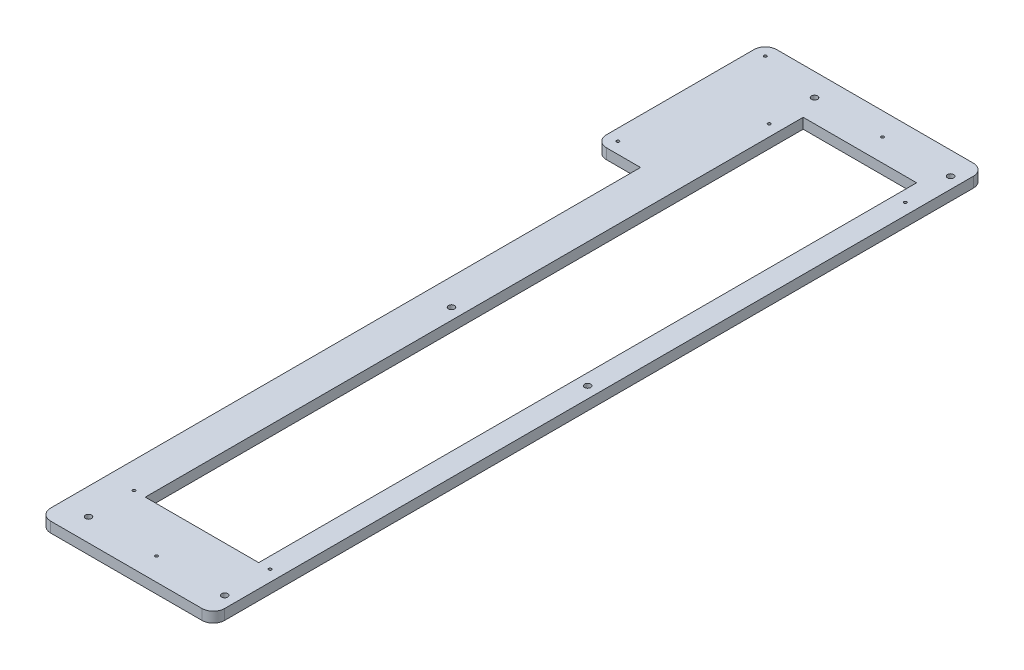
ISO-10303-21;
HEADER;
FILE_DESCRIPTION(('STEP AP214'),'2;1');
FILE_NAME('part.step','',(''),(''),'','','');
FILE_SCHEMA(('AUTOMOTIVE_DESIGN { 1 0 10303 214 1 1 1 1 }'));
ENDSEC;
DATA;
#1=APPLICATION_CONTEXT('core data for automotive mechanical design processes');
#2=APPLICATION_PROTOCOL_DEFINITION('international standard','automotive_design',2000,#1);
#3=PRODUCT_CONTEXT('',#1,'mechanical');
#4=PRODUCT('Part','Part','',(#3));
#5=PRODUCT_RELATED_PRODUCT_CATEGORY('part','',(#4));
#6=PRODUCT_DEFINITION_FORMATION('','',#4);
#7=PRODUCT_DEFINITION_CONTEXT('part definition',#1,'design');
#8=PRODUCT_DEFINITION('design','',#6,#7);
#9=PRODUCT_DEFINITION_SHAPE('','',#8);
#10=(LENGTH_UNIT() NAMED_UNIT(*) SI_UNIT(.MILLI.,.METRE.));
#11=(NAMED_UNIT(*) PLANE_ANGLE_UNIT() SI_UNIT($,.RADIAN.));
#12=(NAMED_UNIT(*) SI_UNIT($,.STERADIAN.) SOLID_ANGLE_UNIT());
#13=UNCERTAINTY_MEASURE_WITH_UNIT(LENGTH_MEASURE(1.E-05),#10,'distance_accuracy_value','');
#14=(GEOMETRIC_REPRESENTATION_CONTEXT(3) GLOBAL_UNCERTAINTY_ASSIGNED_CONTEXT((#13)) GLOBAL_UNIT_ASSIGNED_CONTEXT((#10,
#11,#12)) REPRESENTATION_CONTEXT('',''));
#15=CARTESIAN_POINT('',(0.,0.,0.));
#16=DIRECTION('',(0.,0.,1.));
#17=DIRECTION('',(1.,0.,0.));
#18=AXIS2_PLACEMENT_3D('',#15,#16,#17);
#19=CARTESIAN_POINT('',(0.,5.8,0.));
#20=DIRECTION('',(-1.,0.,0.));
#21=DIRECTION('',(0.,0.,1.));
#22=AXIS2_PLACEMENT_3D('',#19,#20,#21);
#23=PLANE('',#22);
#24=DIRECTION('',(0.,0.,-1.));
#25=VECTOR('',#24,1.);
#26=CARTESIAN_POINT('',(0.,5.8,0.));
#27=LINE('',#26,#25);
#28=CARTESIAN_POINT('',(0.,5.8,425.45));
#29=VERTEX_POINT('',#28);
#30=CARTESIAN_POINT('',(0.,5.8,6.35));
#31=VERTEX_POINT('',#30);
#32=EDGE_CURVE('E220',#29,#31,#27,.T.);
#33=ORIENTED_EDGE('',*,*,#32,.F.);
#34=DIRECTION('',(0.,-1.,0.));
#35=VECTOR('',#34,1.);
#36=CARTESIAN_POINT('',(0.,5.8,425.45));
#37=LINE('',#36,#35);
#38=CARTESIAN_POINT('',(0.,0.,425.45));
#39=VERTEX_POINT('',#38);
#40=EDGE_CURVE('E417',#29,#39,#37,.T.);
#41=ORIENTED_EDGE('',*,*,#40,.T.);
#42=DIRECTION('',(0.,0.,-1.));
#43=VECTOR('',#42,1.);
#44=CARTESIAN_POINT('',(0.,0.,0.));
#45=LINE('',#44,#43);
#46=CARTESIAN_POINT('',(0.,0.,6.35));
#47=VERTEX_POINT('',#46);
#48=EDGE_CURVE('E224',#39,#47,#45,.T.);
#49=ORIENTED_EDGE('',*,*,#48,.T.);
#50=DIRECTION('',(0.,-1.,0.));
#51=VECTOR('',#50,1.);
#52=CARTESIAN_POINT('',(0.,5.8,6.35));
#53=LINE('',#52,#51);
#54=EDGE_CURVE('E230',#47,#31,#53,.F.);
#55=ORIENTED_EDGE('',*,*,#54,.T.);
#56=EDGE_LOOP('',(#33,#41,#49,#55));
#57=FACE_BOUND('',#56,.T.);
#58=ADVANCED_FACE('F34',(#57),#23,.F.);
#59=CARTESIAN_POINT('',(0.,5.8,0.));
#60=DIRECTION('',(0.,0.,1.));
#61=DIRECTION('',(1.,0.,0.));
#62=AXIS2_PLACEMENT_3D('',#59,#60,#61);
#63=PLANE('',#62);
#64=DIRECTION('',(-1.,0.,0.));
#65=VECTOR('',#64,1.);
#66=CARTESIAN_POINT('',(0.,5.8,0.));
#67=LINE('',#66,#65);
#68=CARTESIAN_POINT('',(-6.35,5.8,0.));
#69=VERTEX_POINT('',#68);
#70=CARTESIAN_POINT('',(-116.45,5.8,0.));
#71=VERTEX_POINT('',#70);
#72=EDGE_CURVE('E231',#69,#71,#67,.T.);
#73=ORIENTED_EDGE('',*,*,#72,.F.);
#74=DIRECTION('',(0.,-1.,0.));
#75=VECTOR('',#74,1.);
#76=CARTESIAN_POINT('',(-6.35,5.8,0.));
#77=LINE('',#76,#75);
#78=CARTESIAN_POINT('',(-6.35,0.,0.));
#79=VERTEX_POINT('',#78);
#80=EDGE_CURVE('E11',#69,#79,#77,.T.);
#81=ORIENTED_EDGE('',*,*,#80,.T.);
#82=DIRECTION('',(-1.,0.,0.));
#83=VECTOR('',#82,1.);
#84=CARTESIAN_POINT('',(0.,0.,0.));
#85=LINE('',#84,#83);
#86=CARTESIAN_POINT('',(-116.45,0.,0.));
#87=VERTEX_POINT('',#86);
#88=EDGE_CURVE('E221',#79,#87,#85,.T.);
#89=ORIENTED_EDGE('',*,*,#88,.T.);
#90=DIRECTION('',(0.,1.,0.));
#91=VECTOR('',#90,1.);
#92=CARTESIAN_POINT('',(-116.45,5.8,0.));
#93=LINE('',#92,#91);
#94=EDGE_CURVE('E42',#87,#71,#93,.T.);
#95=ORIENTED_EDGE('',*,*,#94,.T.);
#96=EDGE_LOOP('',(#73,#81,#89,#95));
#97=FACE_BOUND('',#96,.T.);
#98=ADVANCED_FACE('F352',(#97),#63,.F.);
#99=CARTESIAN_POINT('',(0.,5.8,431.8));
#100=DIRECTION('',(0.,0.,-1.));
#101=DIRECTION('',(-1.,0.,0.));
#102=AXIS2_PLACEMENT_3D('',#99,#100,#101);
#103=PLANE('',#102);
#104=DIRECTION('',(1.,0.,0.));
#105=VECTOR('',#104,1.);
#106=CARTESIAN_POINT('',(0.,0.,431.8));
#107=LINE('',#106,#105);
#108=CARTESIAN_POINT('',(-91.05,0.,431.8));
#109=VERTEX_POINT('',#108);
#110=CARTESIAN_POINT('',(-6.34999999999995,0.,431.8));
#111=VERTEX_POINT('',#110);
#112=EDGE_CURVE('E217',#109,#111,#107,.T.);
#113=ORIENTED_EDGE('',*,*,#112,.T.);
#114=DIRECTION('',(0.,-1.,0.));
#115=VECTOR('',#114,1.);
#116=CARTESIAN_POINT('',(-6.34999999999995,5.8,431.8));
#117=LINE('',#116,#115);
#118=CARTESIAN_POINT('',(-6.34999999999995,5.8,431.8));
#119=VERTEX_POINT('',#118);
#120=EDGE_CURVE('E389',#111,#119,#117,.F.);
#121=ORIENTED_EDGE('',*,*,#120,.T.);
#122=DIRECTION('',(1.,0.,0.));
#123=VECTOR('',#122,1.);
#124=CARTESIAN_POINT('',(0.,5.8,431.8));
#125=LINE('',#124,#123);
#126=CARTESIAN_POINT('',(-91.05,5.8,431.8));
#127=VERTEX_POINT('',#126);
#128=EDGE_CURVE('E228',#127,#119,#125,.T.);
#129=ORIENTED_EDGE('',*,*,#128,.F.);
#130=DIRECTION('',(0.,1.,0.));
#131=VECTOR('',#130,1.);
#132=CARTESIAN_POINT('',(-91.05,0.,431.8));
#133=LINE('',#132,#131);
#134=EDGE_CURVE('E429',#127,#109,#133,.F.);
#135=ORIENTED_EDGE('',*,*,#134,.T.);
#136=EDGE_LOOP('',(#113,#121,#129,#135));
#137=FACE_BOUND('',#136,.T.);
#138=ADVANCED_FACE('F321',(#137),#103,.F.);
#139=CARTESIAN_POINT('',(0.,5.8,431.8));
#140=DIRECTION('',(0.,-1.,0.));
#141=DIRECTION('',(0.,0.,-1.));
#142=AXIS2_PLACEMENT_3D('',#139,#140,#141);
#143=PLANE('',#142);
#144=CARTESIAN_POINT('',(-116.45,5.8,6.35));
#145=DIRECTION('',(0.,1.,0.));
#146=DIRECTION('',(0.,0.,1.));
#147=AXIS2_PLACEMENT_3D('',#144,#145,#146);
#148=CIRCLE('',#147,0.793749999999993);
#149=CARTESIAN_POINT('',(-116.45,5.8,7.14374999999999));
#150=VERTEX_POINT('',#149);
#151=EDGE_CURVE('E445',#150,#150,#148,.T.);
#152=ORIENTED_EDGE('',*,*,#151,.F.);
#153=EDGE_LOOP('',(#152));
#154=FACE_BOUND('',#153,.T.);
#155=CARTESIAN_POINT('',(-116.45,5.8,88.9));
#156=DIRECTION('',(0.,1.,0.));
#157=DIRECTION('',(0.,0.,1.));
#158=AXIS2_PLACEMENT_3D('',#155,#156,#157);
#159=CIRCLE('',#158,0.793749999999993);
#160=CARTESIAN_POINT('',(-116.45,5.8,89.69375));
#161=VERTEX_POINT('',#160);
#162=EDGE_CURVE('E441',#161,#161,#159,.T.);
#163=ORIENTED_EDGE('',*,*,#162,.F.);
#164=EDGE_LOOP('',(#163));
#165=FACE_BOUND('',#164,.T.);
#166=CARTESIAN_POINT('',(-44.4499999999999,5.8,419.1));
#167=DIRECTION('',(0.,1.,0.));
#168=DIRECTION('',(0.,0.,-1.));
#169=AXIS2_PLACEMENT_3D('',#166,#167,#168);
#170=CIRCLE('',#169,0.793750000000007);
#171=CARTESIAN_POINT('',(-44.4499999999999,5.8,418.30625));
#172=VERTEX_POINT('',#171);
#173=EDGE_CURVE('E164',#172,#172,#170,.T.);
#174=ORIENTED_EDGE('',*,*,#173,.F.);
#175=EDGE_LOOP('',(#174));
#176=FACE_BOUND('',#175,.T.);
#177=CARTESIAN_POINT('',(-82.5499999999999,5.8,393.7));
#178=DIRECTION('',(0.,1.,0.));
#179=DIRECTION('',(0.,0.,-1.));
#180=AXIS2_PLACEMENT_3D('',#177,#178,#179);
#181=CIRCLE('',#180,0.793749999999984);
#182=CARTESIAN_POINT('',(-82.5499999999999,5.8,392.90625));
#183=VERTEX_POINT('',#182);
#184=EDGE_CURVE('E181',#183,#183,#181,.T.);
#185=ORIENTED_EDGE('',*,*,#184,.F.);
#186=EDGE_LOOP('',(#185));
#187=FACE_BOUND('',#186,.T.);
#188=CARTESIAN_POINT('',(-6.34999999999995,5.8,393.7));
#189=DIRECTION('',(0.,1.,0.));
#190=DIRECTION('',(0.,0.,-1.));
#191=AXIS2_PLACEMENT_3D('',#188,#189,#190);
#192=CIRCLE('',#191,0.793750000000008);
#193=CARTESIAN_POINT('',(-6.34999999999995,5.8,392.90625));
#194=VERTEX_POINT('',#193);
#195=EDGE_CURVE('E186',#194,#194,#192,.T.);
#196=ORIENTED_EDGE('',*,*,#195,.F.);
#197=EDGE_LOOP('',(#196));
#198=FACE_BOUND('',#197,.T.);
#199=CARTESIAN_POINT('',(-6.34999999999999,5.8,38.1));
#200=DIRECTION('',(0.,1.,0.));
#201=DIRECTION('',(0.,0.,1.));
#202=AXIS2_PLACEMENT_3D('',#199,#200,#201);
#203=CIRCLE('',#202,0.79375);
#204=CARTESIAN_POINT('',(-6.34999999999999,5.8,38.89375));
#205=VERTEX_POINT('',#204);
#206=EDGE_CURVE('E192',#205,#205,#203,.T.);
#207=ORIENTED_EDGE('',*,*,#206,.F.);
#208=EDGE_LOOP('',(#207));
#209=FACE_BOUND('',#208,.T.);
#210=CARTESIAN_POINT('',(-82.55,5.8,38.1));
#211=DIRECTION('',(0.,1.,0.));
#212=DIRECTION('',(0.,0.,1.));
#213=AXIS2_PLACEMENT_3D('',#210,#211,#212);
#214=CIRCLE('',#213,0.793749999999993);
#215=CARTESIAN_POINT('',(-82.55,5.8,38.89375));
#216=VERTEX_POINT('',#215);
#217=EDGE_CURVE('E198',#216,#216,#214,.T.);
#218=ORIENTED_EDGE('',*,*,#217,.F.);
#219=EDGE_LOOP('',(#218));
#220=FACE_BOUND('',#219,.T.);
#221=CARTESIAN_POINT('',(-44.45,5.8,12.7));
#222=DIRECTION('',(0.,1.,0.));
#223=DIRECTION('',(0.,0.,1.));
#224=AXIS2_PLACEMENT_3D('',#221,#222,#223);
#225=CIRCLE('',#224,0.79375);
#226=CARTESIAN_POINT('',(-44.45,5.8,13.49375));
#227=VERTEX_POINT('',#226);
#228=EDGE_CURVE('E204',#227,#227,#225,.T.);
#229=ORIENTED_EDGE('',*,*,#228,.F.);
#230=EDGE_LOOP('',(#229));
#231=FACE_BOUND('',#230,.T.);
#232=DIRECTION('',(1.,0.,0.));
#233=VECTOR('',#232,1.);
#234=CARTESIAN_POINT('',(-76.2,5.8,393.7));
#235=LINE('',#234,#233);
#236=CARTESIAN_POINT('',(-76.2,5.8,393.7));
#237=VERTEX_POINT('',#236);
#238=CARTESIAN_POINT('',(-12.7,5.8,393.7));
#239=VERTEX_POINT('',#238);
#240=EDGE_CURVE('E287',#237,#239,#235,.T.);
#241=ORIENTED_EDGE('',*,*,#240,.F.);
#242=DIRECTION('',(0.,0.,1.));
#243=VECTOR('',#242,1.);
#244=CARTESIAN_POINT('',(-76.2,5.8,25.4));
#245=LINE('',#244,#243);
#246=CARTESIAN_POINT('',(-76.2,5.8,25.4));
#247=VERTEX_POINT('',#246);
#248=EDGE_CURVE('E290',#247,#237,#245,.T.);
#249=ORIENTED_EDGE('',*,*,#248,.F.);
#250=DIRECTION('',(-1.,0.,0.));
#251=VECTOR('',#250,1.);
#252=CARTESIAN_POINT('',(-76.2,5.8,25.4));
#253=LINE('',#252,#251);
#254=CARTESIAN_POINT('',(-12.7,5.8,25.4));
#255=VERTEX_POINT('',#254);
#256=EDGE_CURVE('E281',#255,#247,#253,.T.);
#257=ORIENTED_EDGE('',*,*,#256,.F.);
#258=DIRECTION('',(0.,0.,-1.));
#259=VECTOR('',#258,1.);
#260=CARTESIAN_POINT('',(-12.7,5.8,25.4));
#261=LINE('',#260,#259);
#262=EDGE_CURVE('E284',#239,#255,#261,.T.);
#263=ORIENTED_EDGE('',*,*,#262,.F.);
#264=EDGE_LOOP('',(#241,#249,#257,#263));
#265=FACE_BOUND('',#264,.T.);
#266=CARTESIAN_POINT('',(-82.55,5.8,12.7));
#267=DIRECTION('',(0.,1.,0.));
#268=DIRECTION('',(0.,0.,1.));
#269=AXIS2_PLACEMENT_3D('',#266,#267,#268);
#270=CIRCLE('',#269,1.69999999999999);
#271=CARTESIAN_POINT('',(-82.55,5.8,14.4));
#272=VERTEX_POINT('',#271);
#273=EDGE_CURVE('E268',#272,#272,#270,.T.);
#274=ORIENTED_EDGE('',*,*,#273,.F.);
#275=EDGE_LOOP('',(#274));
#276=FACE_BOUND('',#275,.T.);
#277=CARTESIAN_POINT('',(-6.34999999999999,5.8,12.7));
#278=DIRECTION('',(0.,1.,0.));
#279=DIRECTION('',(0.,0.,1.));
#280=AXIS2_PLACEMENT_3D('',#277,#278,#279);
#281=CIRCLE('',#280,1.7);
#282=CARTESIAN_POINT('',(-6.34999999999999,5.8,14.4));
#283=VERTEX_POINT('',#282);
#284=EDGE_CURVE('E262',#283,#283,#281,.T.);
#285=ORIENTED_EDGE('',*,*,#284,.F.);
#286=EDGE_LOOP('',(#285));
#287=FACE_BOUND('',#286,.T.);
#288=CARTESIAN_POINT('',(-6.34999999999999,5.8,419.1));
#289=DIRECTION('',(0.,1.,0.));
#290=DIRECTION('',(0.,0.,1.));
#291=AXIS2_PLACEMENT_3D('',#288,#289,#290);
#292=CIRCLE('',#291,1.7);
#293=CARTESIAN_POINT('',(-6.34999999999999,5.8,420.8));
#294=VERTEX_POINT('',#293);
#295=EDGE_CURVE('E256',#294,#294,#292,.T.);
#296=ORIENTED_EDGE('',*,*,#295,.F.);
#297=EDGE_LOOP('',(#296));
#298=FACE_BOUND('',#297,.T.);
#299=CARTESIAN_POINT('',(-82.55,5.8,419.1));
#300=DIRECTION('',(0.,1.,0.));
#301=DIRECTION('',(0.,0.,1.));
#302=AXIS2_PLACEMENT_3D('',#299,#300,#301);
#303=CIRCLE('',#302,1.69999999999999);
#304=CARTESIAN_POINT('',(-82.55,5.8,420.8));
#305=VERTEX_POINT('',#304);
#306=EDGE_CURVE('E250',#305,#305,#303,.T.);
#307=ORIENTED_EDGE('',*,*,#306,.F.);
#308=EDGE_LOOP('',(#307));
#309=FACE_BOUND('',#308,.T.);
#310=CARTESIAN_POINT('',(-82.55,5.8,215.9));
#311=DIRECTION('',(0.,1.,0.));
#312=DIRECTION('',(0.,0.,1.));
#313=AXIS2_PLACEMENT_3D('',#310,#311,#312);
#314=CIRCLE('',#313,1.69999999999999);
#315=CARTESIAN_POINT('',(-82.55,5.8,217.6));
#316=VERTEX_POINT('',#315);
#317=EDGE_CURVE('E244',#316,#316,#314,.T.);
#318=ORIENTED_EDGE('',*,*,#317,.F.);
#319=EDGE_LOOP('',(#318));
#320=FACE_BOUND('',#319,.T.);
#321=CARTESIAN_POINT('',(-6.34999999999994,5.8,215.9));
#322=DIRECTION('',(0.,1.,0.));
#323=DIRECTION('',(0.,0.,1.));
#324=AXIS2_PLACEMENT_3D('',#321,#322,#323);
#325=CIRCLE('',#324,1.7);
#326=CARTESIAN_POINT('',(-6.34999999999994,5.8,217.6));
#327=VERTEX_POINT('',#326);
#328=EDGE_CURVE('E238',#327,#327,#325,.T.);
#329=ORIENTED_EDGE('',*,*,#328,.F.);
#330=EDGE_LOOP('',(#329));
#331=FACE_BOUND('',#330,.T.);
#332=ORIENTED_EDGE('',*,*,#128,.T.);
#333=CARTESIAN_POINT('',(-6.34999999999995,5.8,425.45));
#334=DIRECTION('',(0.,-1.,0.));
#335=DIRECTION('',(0.,0.,-1.));
#336=AXIS2_PLACEMENT_3D('',#333,#334,#335);
#337=CIRCLE('',#336,6.35);
#338=EDGE_CURVE('E393',#119,#29,#337,.F.);
#339=ORIENTED_EDGE('',*,*,#338,.T.);
#340=ORIENTED_EDGE('',*,*,#32,.T.);
#341=CARTESIAN_POINT('',(-6.35,5.8,6.35));
#342=DIRECTION('',(0.,-1.,0.));
#343=DIRECTION('',(0.,0.,-1.));
#344=AXIS2_PLACEMENT_3D('',#341,#342,#343);
#345=CIRCLE('',#344,6.35);
#346=EDGE_CURVE('E384',#31,#69,#345,.F.);
#347=ORIENTED_EDGE('',*,*,#346,.T.);
#348=ORIENTED_EDGE('',*,*,#72,.T.);
#349=CARTESIAN_POINT('',(-116.45,5.8,6.35000000000001));
#350=DIRECTION('',(0.,-1.,0.));
#351=DIRECTION('',(0.,0.,-1.));
#352=AXIS2_PLACEMENT_3D('',#349,#350,#351);
#353=CIRCLE('',#352,6.35);
#354=CARTESIAN_POINT('',(-122.8,5.8,6.35000000000001));
#355=VERTEX_POINT('',#354);
#356=EDGE_CURVE('E386',#71,#355,#353,.F.);
#357=ORIENTED_EDGE('',*,*,#356,.T.);
#358=DIRECTION('',(0.,0.,1.));
#359=VECTOR('',#358,1.);
#360=CARTESIAN_POINT('',(-122.8,5.8,0.));
#361=LINE('',#360,#359);
#362=CARTESIAN_POINT('',(-122.8,5.8,88.9));
#363=VERTEX_POINT('',#362);
#364=EDGE_CURVE('E149',#355,#363,#361,.T.);
#365=ORIENTED_EDGE('',*,*,#364,.T.);
#366=CARTESIAN_POINT('',(-116.45,5.8,88.9));
#367=DIRECTION('',(0.,-1.,0.));
#368=DIRECTION('',(0.,0.,-1.));
#369=AXIS2_PLACEMENT_3D('',#366,#367,#368);
#370=CIRCLE('',#369,6.35);
#371=CARTESIAN_POINT('',(-116.45,5.8,95.25));
#372=VERTEX_POINT('',#371);
#373=EDGE_CURVE('E57',#363,#372,#370,.F.);
#374=ORIENTED_EDGE('',*,*,#373,.T.);
#375=DIRECTION('',(1.,0.,0.));
#376=VECTOR('',#375,1.);
#377=CARTESIAN_POINT('',(-97.4,5.8,95.25));
#378=LINE('',#377,#376);
#379=CARTESIAN_POINT('',(-97.4,5.8,95.25));
#380=VERTEX_POINT('',#379);
#381=EDGE_CURVE('E140',#372,#380,#378,.T.);
#382=ORIENTED_EDGE('',*,*,#381,.T.);
#383=DIRECTION('',(0.,0.,1.));
#384=VECTOR('',#383,1.);
#385=CARTESIAN_POINT('',(-97.4,5.8,0.));
#386=LINE('',#385,#384);
#387=CARTESIAN_POINT('',(-97.4,5.8,425.45));
#388=VERTEX_POINT('',#387);
#389=EDGE_CURVE('E144',#380,#388,#386,.T.);
#390=ORIENTED_EDGE('',*,*,#389,.T.);
#391=CARTESIAN_POINT('',(-91.05,5.8,425.45));
#392=DIRECTION('',(0.,-1.,0.));
#393=DIRECTION('',(0.,0.,-1.));
#394=AXIS2_PLACEMENT_3D('',#391,#392,#393);
#395=CIRCLE('',#394,6.35);
#396=EDGE_CURVE('E49',#388,#127,#395,.F.);
#397=ORIENTED_EDGE('',*,*,#396,.T.);
#398=EDGE_LOOP('',(#332,#339,#340,#347,#348,#357,#365,#374,#382,#390,#397));
#399=FACE_BOUND('',#398,.T.);
#400=ADVANCED_FACE('F143',(#154,#165,#176,#187,#198,#209,#220,#231,#265,#276,#287,#298,#309,
#320,#331,#399),#143,.F.);
#401=CARTESIAN_POINT('',(0.,0.,431.8));
#402=DIRECTION('',(0.,-1.,0.));
#403=DIRECTION('',(0.,0.,-1.));
#404=AXIS2_PLACEMENT_3D('',#401,#402,#403);
#405=PLANE('',#404);
#406=CARTESIAN_POINT('',(-116.45,0.,6.35));
#407=DIRECTION('',(0.,-1.,0.));
#408=DIRECTION('',(0.,0.,-1.));
#409=AXIS2_PLACEMENT_3D('',#406,#407,#408);
#410=CIRCLE('',#409,0.793749999999993);
#411=CARTESIAN_POINT('',(-116.45,0.,5.55625000000001));
#412=VERTEX_POINT('',#411);
#413=EDGE_CURVE('E444',#412,#412,#410,.T.);
#414=ORIENTED_EDGE('',*,*,#413,.F.);
#415=EDGE_LOOP('',(#414));
#416=FACE_BOUND('',#415,.T.);
#417=CARTESIAN_POINT('',(-116.45,0.,88.9));
#418=DIRECTION('',(0.,-1.,0.));
#419=DIRECTION('',(0.,0.,-1.));
#420=AXIS2_PLACEMENT_3D('',#417,#418,#419);
#421=CIRCLE('',#420,0.793749999999993);
#422=CARTESIAN_POINT('',(-116.45,0.,88.10625));
#423=VERTEX_POINT('',#422);
#424=EDGE_CURVE('E413',#423,#423,#421,.T.);
#425=ORIENTED_EDGE('',*,*,#424,.F.);
#426=EDGE_LOOP('',(#425));
#427=FACE_BOUND('',#426,.T.);
#428=CARTESIAN_POINT('',(-44.4499999999999,0.,419.1));
#429=DIRECTION('',(0.,1.,0.));
#430=DIRECTION('',(0.,0.,-1.));
#431=AXIS2_PLACEMENT_3D('',#428,#429,#430);
#432=CIRCLE('',#431,0.793750000000007);
#433=CARTESIAN_POINT('',(-44.4499999999999,0.,418.30625));
#434=VERTEX_POINT('',#433);
#435=EDGE_CURVE('E167',#434,#434,#432,.T.);
#436=ORIENTED_EDGE('',*,*,#435,.T.);
#437=EDGE_LOOP('',(#436));
#438=FACE_BOUND('',#437,.T.);
#439=CARTESIAN_POINT('',(-82.5499999999999,0.,393.7));
#440=DIRECTION('',(0.,1.,0.));
#441=DIRECTION('',(0.,0.,-1.));
#442=AXIS2_PLACEMENT_3D('',#439,#440,#441);
#443=CIRCLE('',#442,0.793749999999984);
#444=CARTESIAN_POINT('',(-82.5499999999999,0.,392.90625));
#445=VERTEX_POINT('',#444);
#446=EDGE_CURVE('E183',#445,#445,#443,.T.);
#447=ORIENTED_EDGE('',*,*,#446,.T.);
#448=EDGE_LOOP('',(#447));
#449=FACE_BOUND('',#448,.T.);
#450=CARTESIAN_POINT('',(-6.34999999999995,0.,393.7));
#451=DIRECTION('',(0.,1.,0.));
#452=DIRECTION('',(0.,0.,-1.));
#453=AXIS2_PLACEMENT_3D('',#450,#451,#452);
#454=CIRCLE('',#453,0.793750000000008);
#455=CARTESIAN_POINT('',(-6.34999999999995,0.,392.90625));
#456=VERTEX_POINT('',#455);
#457=EDGE_CURVE('E189',#456,#456,#454,.T.);
#458=ORIENTED_EDGE('',*,*,#457,.T.);
#459=EDGE_LOOP('',(#458));
#460=FACE_BOUND('',#459,.T.);
#461=CARTESIAN_POINT('',(-6.34999999999999,0.,38.1));
#462=DIRECTION('',(0.,1.,0.));
#463=DIRECTION('',(0.,0.,1.));
#464=AXIS2_PLACEMENT_3D('',#461,#462,#463);
#465=CIRCLE('',#464,0.79375);
#466=CARTESIAN_POINT('',(-6.34999999999999,0.,38.89375));
#467=VERTEX_POINT('',#466);
#468=EDGE_CURVE('E195',#467,#467,#465,.T.);
#469=ORIENTED_EDGE('',*,*,#468,.T.);
#470=EDGE_LOOP('',(#469));
#471=FACE_BOUND('',#470,.T.);
#472=CARTESIAN_POINT('',(-82.55,0.,38.1));
#473=DIRECTION('',(0.,1.,0.));
#474=DIRECTION('',(0.,0.,1.));
#475=AXIS2_PLACEMENT_3D('',#472,#473,#474);
#476=CIRCLE('',#475,0.793749999999993);
#477=CARTESIAN_POINT('',(-82.55,0.,38.89375));
#478=VERTEX_POINT('',#477);
#479=EDGE_CURVE('E201',#478,#478,#476,.T.);
#480=ORIENTED_EDGE('',*,*,#479,.T.);
#481=EDGE_LOOP('',(#480));
#482=FACE_BOUND('',#481,.T.);
#483=CARTESIAN_POINT('',(-44.45,0.,12.7));
#484=DIRECTION('',(0.,1.,0.));
#485=DIRECTION('',(0.,0.,1.));
#486=AXIS2_PLACEMENT_3D('',#483,#484,#485);
#487=CIRCLE('',#486,0.79375);
#488=CARTESIAN_POINT('',(-44.45,0.,13.49375));
#489=VERTEX_POINT('',#488);
#490=EDGE_CURVE('E159',#489,#489,#487,.T.);
#491=ORIENTED_EDGE('',*,*,#490,.T.);
#492=EDGE_LOOP('',(#491));
#493=FACE_BOUND('',#492,.T.);
#494=DIRECTION('',(0.,0.,1.));
#495=VECTOR('',#494,1.);
#496=CARTESIAN_POINT('',(-76.2,0.,25.4));
#497=LINE('',#496,#495);
#498=CARTESIAN_POINT('',(-76.2,0.,25.4));
#499=VERTEX_POINT('',#498);
#500=CARTESIAN_POINT('',(-76.2,0.,393.7));
#501=VERTEX_POINT('',#500);
#502=EDGE_CURVE('E214',#499,#501,#497,.T.);
#503=ORIENTED_EDGE('',*,*,#502,.T.);
#504=DIRECTION('',(1.,0.,0.));
#505=VECTOR('',#504,1.);
#506=CARTESIAN_POINT('',(-76.2,0.,393.7));
#507=LINE('',#506,#505);
#508=CARTESIAN_POINT('',(-12.7,0.,393.7));
#509=VERTEX_POINT('',#508);
#510=EDGE_CURVE('E296',#501,#509,#507,.T.);
#511=ORIENTED_EDGE('',*,*,#510,.T.);
#512=DIRECTION('',(0.,0.,-1.));
#513=VECTOR('',#512,1.);
#514=CARTESIAN_POINT('',(-12.7,0.,25.4));
#515=LINE('',#514,#513);
#516=CARTESIAN_POINT('',(-12.7,0.,25.4));
#517=VERTEX_POINT('',#516);
#518=EDGE_CURVE('E294',#509,#517,#515,.T.);
#519=ORIENTED_EDGE('',*,*,#518,.T.);
#520=DIRECTION('',(-1.,0.,0.));
#521=VECTOR('',#520,1.);
#522=CARTESIAN_POINT('',(-76.2,0.,25.4));
#523=LINE('',#522,#521);
#524=EDGE_CURVE('E276',#517,#499,#523,.T.);
#525=ORIENTED_EDGE('',*,*,#524,.T.);
#526=EDGE_LOOP('',(#503,#511,#519,#525));
#527=FACE_BOUND('',#526,.T.);
#528=CARTESIAN_POINT('',(-82.55,0.,12.7));
#529=DIRECTION('',(0.,1.,0.));
#530=DIRECTION('',(0.,0.,1.));
#531=AXIS2_PLACEMENT_3D('',#528,#529,#530);
#532=CIRCLE('',#531,1.69999999999999);
#533=CARTESIAN_POINT('',(-82.55,0.,14.4));
#534=VERTEX_POINT('',#533);
#535=EDGE_CURVE('E265',#534,#534,#532,.T.);
#536=ORIENTED_EDGE('',*,*,#535,.T.);
#537=EDGE_LOOP('',(#536));
#538=FACE_BOUND('',#537,.T.);
#539=CARTESIAN_POINT('',(-6.34999999999999,0.,12.7));
#540=DIRECTION('',(0.,1.,0.));
#541=DIRECTION('',(0.,0.,1.));
#542=AXIS2_PLACEMENT_3D('',#539,#540,#541);
#543=CIRCLE('',#542,1.7);
#544=CARTESIAN_POINT('',(-6.34999999999999,0.,14.4));
#545=VERTEX_POINT('',#544);
#546=EDGE_CURVE('E259',#545,#545,#543,.T.);
#547=ORIENTED_EDGE('',*,*,#546,.T.);
#548=EDGE_LOOP('',(#547));
#549=FACE_BOUND('',#548,.T.);
#550=CARTESIAN_POINT('',(-6.34999999999999,0.,419.1));
#551=DIRECTION('',(0.,1.,0.));
#552=DIRECTION('',(0.,0.,1.));
#553=AXIS2_PLACEMENT_3D('',#550,#551,#552);
#554=CIRCLE('',#553,1.7);
#555=CARTESIAN_POINT('',(-6.34999999999999,0.,420.8));
#556=VERTEX_POINT('',#555);
#557=EDGE_CURVE('E253',#556,#556,#554,.T.);
#558=ORIENTED_EDGE('',*,*,#557,.T.);
#559=EDGE_LOOP('',(#558));
#560=FACE_BOUND('',#559,.T.);
#561=CARTESIAN_POINT('',(-82.55,0.,419.1));
#562=DIRECTION('',(0.,1.,0.));
#563=DIRECTION('',(0.,0.,1.));
#564=AXIS2_PLACEMENT_3D('',#561,#562,#563);
#565=CIRCLE('',#564,1.69999999999999);
#566=CARTESIAN_POINT('',(-82.55,0.,420.8));
#567=VERTEX_POINT('',#566);
#568=EDGE_CURVE('E247',#567,#567,#565,.T.);
#569=ORIENTED_EDGE('',*,*,#568,.T.);
#570=EDGE_LOOP('',(#569));
#571=FACE_BOUND('',#570,.T.);
#572=CARTESIAN_POINT('',(-82.55,0.,215.9));
#573=DIRECTION('',(0.,1.,0.));
#574=DIRECTION('',(0.,0.,1.));
#575=AXIS2_PLACEMENT_3D('',#572,#573,#574);
#576=CIRCLE('',#575,1.69999999999999);
#577=CARTESIAN_POINT('',(-82.55,0.,217.6));
#578=VERTEX_POINT('',#577);
#579=EDGE_CURVE('E241',#578,#578,#576,.T.);
#580=ORIENTED_EDGE('',*,*,#579,.T.);
#581=EDGE_LOOP('',(#580));
#582=FACE_BOUND('',#581,.T.);
#583=CARTESIAN_POINT('',(-6.34999999999994,0.,215.9));
#584=DIRECTION('',(0.,1.,0.));
#585=DIRECTION('',(0.,0.,1.));
#586=AXIS2_PLACEMENT_3D('',#583,#584,#585);
#587=CIRCLE('',#586,1.7);
#588=CARTESIAN_POINT('',(-6.34999999999994,0.,217.6));
#589=VERTEX_POINT('',#588);
#590=EDGE_CURVE('E227',#589,#589,#587,.T.);
#591=ORIENTED_EDGE('',*,*,#590,.T.);
#592=EDGE_LOOP('',(#591));
#593=FACE_BOUND('',#592,.T.);
#594=ORIENTED_EDGE('',*,*,#48,.F.);
#595=CARTESIAN_POINT('',(-6.34999999999995,0.,425.45));
#596=DIRECTION('',(0.,-1.,0.));
#597=DIRECTION('',(0.,0.,-1.));
#598=AXIS2_PLACEMENT_3D('',#595,#596,#597);
#599=CIRCLE('',#598,6.35);
#600=EDGE_CURVE('E427',#39,#111,#599,.T.);
#601=ORIENTED_EDGE('',*,*,#600,.T.);
#602=ORIENTED_EDGE('',*,*,#112,.F.);
#603=CARTESIAN_POINT('',(-91.05,0.,425.45));
#604=DIRECTION('',(0.,-1.,0.));
#605=DIRECTION('',(0.,0.,-1.));
#606=AXIS2_PLACEMENT_3D('',#603,#604,#605);
#607=CIRCLE('',#606,6.35);
#608=CARTESIAN_POINT('',(-97.4,0.,425.45));
#609=VERTEX_POINT('',#608);
#610=EDGE_CURVE('E425',#109,#609,#607,.T.);
#611=ORIENTED_EDGE('',*,*,#610,.T.);
#612=DIRECTION('',(0.,0.,1.));
#613=VECTOR('',#612,1.);
#614=CARTESIAN_POINT('',(-97.4,0.,0.));
#615=LINE('',#614,#613);
#616=CARTESIAN_POINT('',(-97.4,0.,95.25));
#617=VERTEX_POINT('',#616);
#618=EDGE_CURVE('E158',#617,#609,#615,.T.);
#619=ORIENTED_EDGE('',*,*,#618,.F.);
#620=DIRECTION('',(1.,0.,0.));
#621=VECTOR('',#620,1.);
#622=CARTESIAN_POINT('',(-97.4,0.,95.25));
#623=LINE('',#622,#621);
#624=CARTESIAN_POINT('',(-116.45,0.,95.25));
#625=VERTEX_POINT('',#624);
#626=EDGE_CURVE('E163',#625,#617,#623,.T.);
#627=ORIENTED_EDGE('',*,*,#626,.F.);
#628=CARTESIAN_POINT('',(-116.45,0.,88.9));
#629=DIRECTION('',(0.,-1.,0.));
#630=DIRECTION('',(0.,0.,-1.));
#631=AXIS2_PLACEMENT_3D('',#628,#629,#630);
#632=CIRCLE('',#631,6.35);
#633=CARTESIAN_POINT('',(-122.8,0.,88.9));
#634=VERTEX_POINT('',#633);
#635=EDGE_CURVE('E419',#625,#634,#632,.T.);
#636=ORIENTED_EDGE('',*,*,#635,.T.);
#637=DIRECTION('',(0.,0.,1.));
#638=VECTOR('',#637,1.);
#639=CARTESIAN_POINT('',(-122.8,0.,0.));
#640=LINE('',#639,#638);
#641=CARTESIAN_POINT('',(-122.8,0.,6.35000000000001));
#642=VERTEX_POINT('',#641);
#643=EDGE_CURVE('E148',#642,#634,#640,.T.);
#644=ORIENTED_EDGE('',*,*,#643,.F.);
#645=CARTESIAN_POINT('',(-116.45,0.,6.35000000000001));
#646=DIRECTION('',(0.,-1.,0.));
#647=DIRECTION('',(0.,0.,-1.));
#648=AXIS2_PLACEMENT_3D('',#645,#646,#647);
#649=CIRCLE('',#648,6.35);
#650=EDGE_CURVE('E414',#642,#87,#649,.T.);
#651=ORIENTED_EDGE('',*,*,#650,.T.);
#652=ORIENTED_EDGE('',*,*,#88,.F.);
#653=CARTESIAN_POINT('',(-6.35,0.,6.35));
#654=DIRECTION('',(0.,-1.,0.));
#655=DIRECTION('',(0.,0.,-1.));
#656=AXIS2_PLACEMENT_3D('',#653,#654,#655);
#657=CIRCLE('',#656,6.35);
#658=EDGE_CURVE('E416',#79,#47,#657,.T.);
#659=ORIENTED_EDGE('',*,*,#658,.T.);
#660=EDGE_LOOP('',(#594,#601,#602,#611,#619,#627,#636,#644,#651,#652,#659));
#661=FACE_BOUND('',#660,.T.);
#662=ADVANCED_FACE('F302',(#416,#427,#438,#449,#460,#471,#482,#493,#527,#538,#549,#560,#571,
#582,#593,#661),#405,.T.);
#663=CARTESIAN_POINT('',(-6.34999999999994,5.8,215.9));
#664=DIRECTION('',(0.,1.,0.));
#665=DIRECTION('',(0.,0.,1.));
#666=AXIS2_PLACEMENT_3D('',#663,#664,#665);
#667=CYLINDRICAL_SURFACE('',#666,1.7);
#668=ORIENTED_EDGE('',*,*,#590,.F.);
#669=EDGE_LOOP('',(#668));
#670=FACE_BOUND('',#669,.T.);
#671=ORIENTED_EDGE('',*,*,#328,.T.);
#672=EDGE_LOOP('',(#671));
#673=FACE_BOUND('',#672,.T.);
#674=ADVANCED_FACE('F336',(#670,#673),#667,.F.);
#675=CARTESIAN_POINT('',(-82.55,5.8,215.9));
#676=DIRECTION('',(0.,1.,0.));
#677=DIRECTION('',(0.,0.,1.));
#678=AXIS2_PLACEMENT_3D('',#675,#676,#677);
#679=CYLINDRICAL_SURFACE('',#678,1.69999999999999);
#680=ORIENTED_EDGE('',*,*,#579,.F.);
#681=EDGE_LOOP('',(#680));
#682=FACE_BOUND('',#681,.T.);
#683=ORIENTED_EDGE('',*,*,#317,.T.);
#684=EDGE_LOOP('',(#683));
#685=FACE_BOUND('',#684,.T.);
#686=ADVANCED_FACE('F338',(#682,#685),#679,.F.);
#687=CARTESIAN_POINT('',(-82.55,5.8,419.1));
#688=DIRECTION('',(0.,1.,0.));
#689=DIRECTION('',(0.,0.,1.));
#690=AXIS2_PLACEMENT_3D('',#687,#688,#689);
#691=CYLINDRICAL_SURFACE('',#690,1.69999999999999);
#692=ORIENTED_EDGE('',*,*,#568,.F.);
#693=EDGE_LOOP('',(#692));
#694=FACE_BOUND('',#693,.T.);
#695=ORIENTED_EDGE('',*,*,#306,.T.);
#696=EDGE_LOOP('',(#695));
#697=FACE_BOUND('',#696,.T.);
#698=ADVANCED_FACE('F345',(#694,#697),#691,.F.);
#699=CARTESIAN_POINT('',(-6.34999999999999,5.8,419.1));
#700=DIRECTION('',(0.,1.,0.));
#701=DIRECTION('',(0.,0.,1.));
#702=AXIS2_PLACEMENT_3D('',#699,#700,#701);
#703=CYLINDRICAL_SURFACE('',#702,1.7);
#704=ORIENTED_EDGE('',*,*,#557,.F.);
#705=EDGE_LOOP('',(#704));
#706=FACE_BOUND('',#705,.T.);
#707=ORIENTED_EDGE('',*,*,#295,.T.);
#708=EDGE_LOOP('',(#707));
#709=FACE_BOUND('',#708,.T.);
#710=ADVANCED_FACE('F507',(#706,#709),#703,.F.);
#711=CARTESIAN_POINT('',(-6.34999999999999,5.8,12.7));
#712=DIRECTION('',(0.,1.,0.));
#713=DIRECTION('',(0.,0.,1.));
#714=AXIS2_PLACEMENT_3D('',#711,#712,#713);
#715=CYLINDRICAL_SURFACE('',#714,1.7);
#716=ORIENTED_EDGE('',*,*,#546,.F.);
#717=EDGE_LOOP('',(#716));
#718=FACE_BOUND('',#717,.T.);
#719=ORIENTED_EDGE('',*,*,#284,.T.);
#720=EDGE_LOOP('',(#719));
#721=FACE_BOUND('',#720,.T.);
#722=ADVANCED_FACE('F503',(#718,#721),#715,.F.);
#723=CARTESIAN_POINT('',(-82.55,5.8,12.7));
#724=DIRECTION('',(0.,1.,0.));
#725=DIRECTION('',(0.,0.,1.));
#726=AXIS2_PLACEMENT_3D('',#723,#724,#725);
#727=CYLINDRICAL_SURFACE('',#726,1.69999999999999);
#728=ORIENTED_EDGE('',*,*,#535,.F.);
#729=EDGE_LOOP('',(#728));
#730=FACE_BOUND('',#729,.T.);
#731=ORIENTED_EDGE('',*,*,#273,.T.);
#732=EDGE_LOOP('',(#731));
#733=FACE_BOUND('',#732,.T.);
#734=ADVANCED_FACE('F500',(#730,#733),#727,.F.);
#735=CARTESIAN_POINT('',(-76.2,0.,25.4));
#736=DIRECTION('',(-1.,0.,0.));
#737=DIRECTION('',(0.,0.,1.));
#738=AXIS2_PLACEMENT_3D('',#735,#736,#737);
#739=PLANE('',#738);
#740=ORIENTED_EDGE('',*,*,#248,.T.);
#741=DIRECTION('',(0.,1.,0.));
#742=VECTOR('',#741,1.);
#743=CARTESIAN_POINT('',(-76.2,0.,393.7));
#744=LINE('',#743,#742);
#745=EDGE_CURVE('E272',#501,#237,#744,.T.);
#746=ORIENTED_EDGE('',*,*,#745,.F.);
#747=ORIENTED_EDGE('',*,*,#502,.F.);
#748=DIRECTION('',(0.,1.,0.));
#749=VECTOR('',#748,1.);
#750=CARTESIAN_POINT('',(-76.2,0.,25.4));
#751=LINE('',#750,#749);
#752=EDGE_CURVE('E271',#499,#247,#751,.T.);
#753=ORIENTED_EDGE('',*,*,#752,.T.);
#754=EDGE_LOOP('',(#740,#746,#747,#753));
#755=FACE_BOUND('',#754,.T.);
#756=ADVANCED_FACE('F306',(#755),#739,.F.);
#757=CARTESIAN_POINT('',(-76.2,0.,25.4));
#758=DIRECTION('',(0.,0.,-1.));
#759=DIRECTION('',(-1.,0.,0.));
#760=AXIS2_PLACEMENT_3D('',#757,#758,#759);
#761=PLANE('',#760);
#762=ORIENTED_EDGE('',*,*,#256,.T.);
#763=ORIENTED_EDGE('',*,*,#752,.F.);
#764=ORIENTED_EDGE('',*,*,#524,.F.);
#765=DIRECTION('',(0.,1.,0.));
#766=VECTOR('',#765,1.);
#767=CARTESIAN_POINT('',(-12.7,0.,25.4));
#768=LINE('',#767,#766);
#769=EDGE_CURVE('E278',#517,#255,#768,.T.);
#770=ORIENTED_EDGE('',*,*,#769,.T.);
#771=EDGE_LOOP('',(#762,#763,#764,#770));
#772=FACE_BOUND('',#771,.T.);
#773=ADVANCED_FACE('F317',(#772),#761,.F.);
#774=CARTESIAN_POINT('',(-12.7,0.,25.4));
#775=DIRECTION('',(1.,0.,0.));
#776=DIRECTION('',(0.,0.,-1.));
#777=AXIS2_PLACEMENT_3D('',#774,#775,#776);
#778=PLANE('',#777);
#779=ORIENTED_EDGE('',*,*,#262,.T.);
#780=ORIENTED_EDGE('',*,*,#769,.F.);
#781=ORIENTED_EDGE('',*,*,#518,.F.);
#782=DIRECTION('',(0.,1.,0.));
#783=VECTOR('',#782,1.);
#784=CARTESIAN_POINT('',(-12.7,0.,393.7));
#785=LINE('',#784,#783);
#786=EDGE_CURVE('E275',#509,#239,#785,.T.);
#787=ORIENTED_EDGE('',*,*,#786,.T.);
#788=EDGE_LOOP('',(#779,#780,#781,#787));
#789=FACE_BOUND('',#788,.T.);
#790=ADVANCED_FACE('F314',(#789),#778,.F.);
#791=CARTESIAN_POINT('',(-76.2,0.,393.7));
#792=DIRECTION('',(0.,0.,1.));
#793=DIRECTION('',(1.,0.,0.));
#794=AXIS2_PLACEMENT_3D('',#791,#792,#793);
#795=PLANE('',#794);
#796=ORIENTED_EDGE('',*,*,#240,.T.);
#797=ORIENTED_EDGE('',*,*,#786,.F.);
#798=ORIENTED_EDGE('',*,*,#510,.F.);
#799=ORIENTED_EDGE('',*,*,#745,.T.);
#800=EDGE_LOOP('',(#796,#797,#798,#799));
#801=FACE_BOUND('',#800,.T.);
#802=ADVANCED_FACE('F311',(#801),#795,.F.);
#803=CARTESIAN_POINT('',(-97.4,0.,0.));
#804=DIRECTION('',(-1.,0.,0.));
#805=DIRECTION('',(0.,0.,1.));
#806=AXIS2_PLACEMENT_3D('',#803,#804,#805);
#807=PLANE('',#806);
#808=ORIENTED_EDGE('',*,*,#618,.T.);
#809=DIRECTION('',(0.,1.,0.));
#810=VECTOR('',#809,1.);
#811=CARTESIAN_POINT('',(-97.4,5.8,425.45));
#812=LINE('',#811,#810);
#813=EDGE_CURVE('E157',#609,#388,#812,.T.);
#814=ORIENTED_EDGE('',*,*,#813,.T.);
#815=ORIENTED_EDGE('',*,*,#389,.F.);
#816=DIRECTION('',(0.,1.,0.));
#817=VECTOR('',#816,1.);
#818=CARTESIAN_POINT('',(-97.4,0.,95.25));
#819=LINE('',#818,#817);
#820=EDGE_CURVE('E155',#617,#380,#819,.T.);
#821=ORIENTED_EDGE('',*,*,#820,.F.);
#822=EDGE_LOOP('',(#808,#814,#815,#821));
#823=FACE_BOUND('',#822,.T.);
#824=ADVANCED_FACE('F154',(#823),#807,.T.);
#825=CARTESIAN_POINT('',(-44.45,0.,12.7));
#826=DIRECTION('',(0.,1.,0.));
#827=DIRECTION('',(0.,0.,1.));
#828=AXIS2_PLACEMENT_3D('',#825,#826,#827);
#829=CYLINDRICAL_SURFACE('',#828,0.79375);
#830=ORIENTED_EDGE('',*,*,#490,.F.);
#831=EDGE_LOOP('',(#830));
#832=FACE_BOUND('',#831,.T.);
#833=ORIENTED_EDGE('',*,*,#228,.T.);
#834=EDGE_LOOP('',(#833));
#835=FACE_BOUND('',#834,.T.);
#836=ADVANCED_FACE('F475',(#832,#835),#829,.F.);
#837=CARTESIAN_POINT('',(-82.55,0.,38.1));
#838=DIRECTION('',(0.,1.,0.));
#839=DIRECTION('',(0.,0.,1.));
#840=AXIS2_PLACEMENT_3D('',#837,#838,#839);
#841=CYLINDRICAL_SURFACE('',#840,0.793749999999993);
#842=ORIENTED_EDGE('',*,*,#479,.F.);
#843=EDGE_LOOP('',(#842));
#844=FACE_BOUND('',#843,.T.);
#845=ORIENTED_EDGE('',*,*,#217,.T.);
#846=EDGE_LOOP('',(#845));
#847=FACE_BOUND('',#846,.T.);
#848=ADVANCED_FACE('F478',(#844,#847),#841,.F.);
#849=CARTESIAN_POINT('',(-6.34999999999999,0.,38.1));
#850=DIRECTION('',(0.,1.,0.));
#851=DIRECTION('',(0.,0.,1.));
#852=AXIS2_PLACEMENT_3D('',#849,#850,#851);
#853=CYLINDRICAL_SURFACE('',#852,0.79375);
#854=ORIENTED_EDGE('',*,*,#468,.F.);
#855=EDGE_LOOP('',(#854));
#856=FACE_BOUND('',#855,.T.);
#857=ORIENTED_EDGE('',*,*,#206,.T.);
#858=EDGE_LOOP('',(#857));
#859=FACE_BOUND('',#858,.T.);
#860=ADVANCED_FACE('F486',(#856,#859),#853,.F.);
#861=CARTESIAN_POINT('',(-6.34999999999995,0.,393.7));
#862=DIRECTION('',(0.,1.,0.));
#863=DIRECTION('',(0.,0.,1.));
#864=AXIS2_PLACEMENT_3D('',#861,#862,#863);
#865=CYLINDRICAL_SURFACE('',#864,0.793750000000008);
#866=ORIENTED_EDGE('',*,*,#457,.F.);
#867=EDGE_LOOP('',(#866));
#868=FACE_BOUND('',#867,.T.);
#869=ORIENTED_EDGE('',*,*,#195,.T.);
#870=EDGE_LOOP('',(#869));
#871=FACE_BOUND('',#870,.T.);
#872=ADVANCED_FACE('F642',(#868,#871),#865,.F.);
#873=CARTESIAN_POINT('',(-82.5499999999999,0.,393.7));
#874=DIRECTION('',(0.,1.,0.));
#875=DIRECTION('',(0.,0.,1.));
#876=AXIS2_PLACEMENT_3D('',#873,#874,#875);
#877=CYLINDRICAL_SURFACE('',#876,0.793749999999984);
#878=ORIENTED_EDGE('',*,*,#446,.F.);
#879=EDGE_LOOP('',(#878));
#880=FACE_BOUND('',#879,.T.);
#881=ORIENTED_EDGE('',*,*,#184,.T.);
#882=EDGE_LOOP('',(#881));
#883=FACE_BOUND('',#882,.T.);
#884=ADVANCED_FACE('F631',(#880,#883),#877,.F.);
#885=CARTESIAN_POINT('',(-44.4499999999999,0.,419.1));
#886=DIRECTION('',(0.,1.,0.));
#887=DIRECTION('',(0.,0.,1.));
#888=AXIS2_PLACEMENT_3D('',#885,#886,#887);
#889=CYLINDRICAL_SURFACE('',#888,0.793750000000007);
#890=ORIENTED_EDGE('',*,*,#435,.F.);
#891=EDGE_LOOP('',(#890));
#892=FACE_BOUND('',#891,.T.);
#893=ORIENTED_EDGE('',*,*,#173,.T.);
#894=EDGE_LOOP('',(#893));
#895=FACE_BOUND('',#894,.T.);
#896=ADVANCED_FACE('F572',(#892,#895),#889,.F.);
#897=CARTESIAN_POINT('',(-97.4,0.,95.25));
#898=DIRECTION('',(0.,0.,1.));
#899=DIRECTION('',(1.,0.,0.));
#900=AXIS2_PLACEMENT_3D('',#897,#898,#899);
#901=PLANE('',#900);
#902=ORIENTED_EDGE('',*,*,#381,.F.);
#903=DIRECTION('',(0.,1.,0.));
#904=VECTOR('',#903,1.);
#905=CARTESIAN_POINT('',(-116.45,0.,95.25));
#906=LINE('',#905,#904);
#907=EDGE_CURVE('E401',#372,#625,#906,.F.);
#908=ORIENTED_EDGE('',*,*,#907,.T.);
#909=ORIENTED_EDGE('',*,*,#626,.T.);
#910=ORIENTED_EDGE('',*,*,#820,.T.);
#911=EDGE_LOOP('',(#902,#908,#909,#910));
#912=FACE_BOUND('',#911,.T.);
#913=ADVANCED_FACE('F161',(#912),#901,.T.);
#914=CARTESIAN_POINT('',(-122.8,0.,0.));
#915=DIRECTION('',(-1.,0.,0.));
#916=DIRECTION('',(0.,0.,1.));
#917=AXIS2_PLACEMENT_3D('',#914,#915,#916);
#918=PLANE('',#917);
#919=ORIENTED_EDGE('',*,*,#643,.T.);
#920=DIRECTION('',(0.,1.,0.));
#921=VECTOR('',#920,1.);
#922=CARTESIAN_POINT('',(-122.8,0.,88.9));
#923=LINE('',#922,#921);
#924=EDGE_CURVE('E398',#634,#363,#923,.T.);
#925=ORIENTED_EDGE('',*,*,#924,.T.);
#926=ORIENTED_EDGE('',*,*,#364,.F.);
#927=DIRECTION('',(0.,1.,0.));
#928=VECTOR('',#927,1.);
#929=CARTESIAN_POINT('',(-122.8,0.,6.35000000000001));
#930=LINE('',#929,#928);
#931=EDGE_CURVE('E396',#355,#642,#930,.F.);
#932=ORIENTED_EDGE('',*,*,#931,.T.);
#933=EDGE_LOOP('',(#919,#925,#926,#932));
#934=FACE_BOUND('',#933,.T.);
#935=ADVANCED_FACE('F410',(#934),#918,.T.);
#936=CARTESIAN_POINT('',(-116.45,-4.99999999997031E-05,88.9));
#937=DIRECTION('',(0.,1.,0.));
#938=DIRECTION('',(0.,0.,1.));
#939=AXIS2_PLACEMENT_3D('',#936,#937,#938);
#940=CYLINDRICAL_SURFACE('',#939,0.793749999999993);
#941=ORIENTED_EDGE('',*,*,#424,.T.);
#942=EDGE_LOOP('',(#941));
#943=FACE_BOUND('',#942,.T.);
#944=ORIENTED_EDGE('',*,*,#162,.T.);
#945=EDGE_LOOP('',(#944));
#946=FACE_BOUND('',#945,.T.);
#947=ADVANCED_FACE('F459',(#943,#946),#940,.F.);
#948=CARTESIAN_POINT('',(-116.45,-4.99999999997031E-05,6.35));
#949=DIRECTION('',(0.,1.,0.));
#950=DIRECTION('',(0.,0.,1.));
#951=AXIS2_PLACEMENT_3D('',#948,#949,#950);
#952=CYLINDRICAL_SURFACE('',#951,0.793749999999993);
#953=ORIENTED_EDGE('',*,*,#413,.T.);
#954=EDGE_LOOP('',(#953));
#955=FACE_BOUND('',#954,.T.);
#956=ORIENTED_EDGE('',*,*,#151,.T.);
#957=EDGE_LOOP('',(#956));
#958=FACE_BOUND('',#957,.T.);
#959=ADVANCED_FACE('F367',(#955,#958),#952,.F.);
#960=CARTESIAN_POINT('',(-6.34999999999995,5.8,425.45));
#961=DIRECTION('',(0.,-1.,0.));
#962=DIRECTION('',(0.,0.,-1.));
#963=AXIS2_PLACEMENT_3D('',#960,#961,#962);
#964=CYLINDRICAL_SURFACE('',#963,6.35);
#965=ORIENTED_EDGE('',*,*,#338,.F.);
#966=ORIENTED_EDGE('',*,*,#120,.F.);
#967=ORIENTED_EDGE('',*,*,#600,.F.);
#968=ORIENTED_EDGE('',*,*,#40,.F.);
#969=EDGE_LOOP('',(#965,#966,#967,#968));
#970=FACE_BOUND('',#969,.T.);
#971=ADVANCED_FACE('F363',(#970),#964,.T.);
#972=CARTESIAN_POINT('',(-91.05,0.,425.45));
#973=DIRECTION('',(0.,-1.,0.));
#974=DIRECTION('',(0.,0.,-1.));
#975=AXIS2_PLACEMENT_3D('',#972,#973,#974);
#976=CYLINDRICAL_SURFACE('',#975,6.35);
#977=ORIENTED_EDGE('',*,*,#610,.F.);
#978=ORIENTED_EDGE('',*,*,#134,.F.);
#979=ORIENTED_EDGE('',*,*,#396,.F.);
#980=ORIENTED_EDGE('',*,*,#813,.F.);
#981=EDGE_LOOP('',(#977,#978,#979,#980));
#982=FACE_BOUND('',#981,.T.);
#983=ADVANCED_FACE('F366',(#982),#976,.T.);
#984=CARTESIAN_POINT('',(-116.45,0.,88.9));
#985=DIRECTION('',(0.,1.,0.));
#986=DIRECTION('',(0.,0.,1.));
#987=AXIS2_PLACEMENT_3D('',#984,#985,#986);
#988=CYLINDRICAL_SURFACE('',#987,6.35);
#989=ORIENTED_EDGE('',*,*,#635,.F.);
#990=ORIENTED_EDGE('',*,*,#907,.F.);
#991=ORIENTED_EDGE('',*,*,#373,.F.);
#992=ORIENTED_EDGE('',*,*,#924,.F.);
#993=EDGE_LOOP('',(#989,#990,#991,#992));
#994=FACE_BOUND('',#993,.T.);
#995=ADVANCED_FACE('F371',(#994),#988,.T.);
#996=CARTESIAN_POINT('',(-6.35,5.8,6.35));
#997=DIRECTION('',(0.,-1.,0.));
#998=DIRECTION('',(0.,0.,-1.));
#999=AXIS2_PLACEMENT_3D('',#996,#997,#998);
#1000=CYLINDRICAL_SURFACE('',#999,6.35);
#1001=ORIENTED_EDGE('',*,*,#346,.F.);
#1002=ORIENTED_EDGE('',*,*,#54,.F.);
#1003=ORIENTED_EDGE('',*,*,#658,.F.);
#1004=ORIENTED_EDGE('',*,*,#80,.F.);
#1005=EDGE_LOOP('',(#1001,#1002,#1003,#1004));
#1006=FACE_BOUND('',#1005,.T.);
#1007=ADVANCED_FACE('F373',(#1006),#1000,.T.);
#1008=CARTESIAN_POINT('',(-116.45,5.8,6.35000000000001));
#1009=DIRECTION('',(0.,-1.,0.));
#1010=DIRECTION('',(0.,0.,-1.));
#1011=AXIS2_PLACEMENT_3D('',#1008,#1009,#1010);
#1012=CYLINDRICAL_SURFACE('',#1011,6.35);
#1013=ORIENTED_EDGE('',*,*,#650,.F.);
#1014=ORIENTED_EDGE('',*,*,#931,.F.);
#1015=ORIENTED_EDGE('',*,*,#356,.F.);
#1016=ORIENTED_EDGE('',*,*,#94,.F.);
#1017=EDGE_LOOP('',(#1013,#1014,#1015,#1016));
#1018=FACE_BOUND('',#1017,.T.);
#1019=ADVANCED_FACE('F36',(#1018),#1012,.T.);
#1020=CLOSED_SHELL('',(#58,#98,#138,#400,#662,#674,#686,#698,#710,#722,#734,#756,#773,#790,#802,
#824,#836,#848,#860,#872,#884,#896,#913,#935,#947,#959,#971,#983,#995,#1007,#1019));
#1021=MANIFOLD_SOLID_BREP('B2',#1020);
#1022=ADVANCED_BREP_SHAPE_REPRESENTATION('',(#18,#1021),#14);
#1023=SHAPE_DEFINITION_REPRESENTATION(#9,#1022);
ENDSEC;
END-ISO-10303-21;
